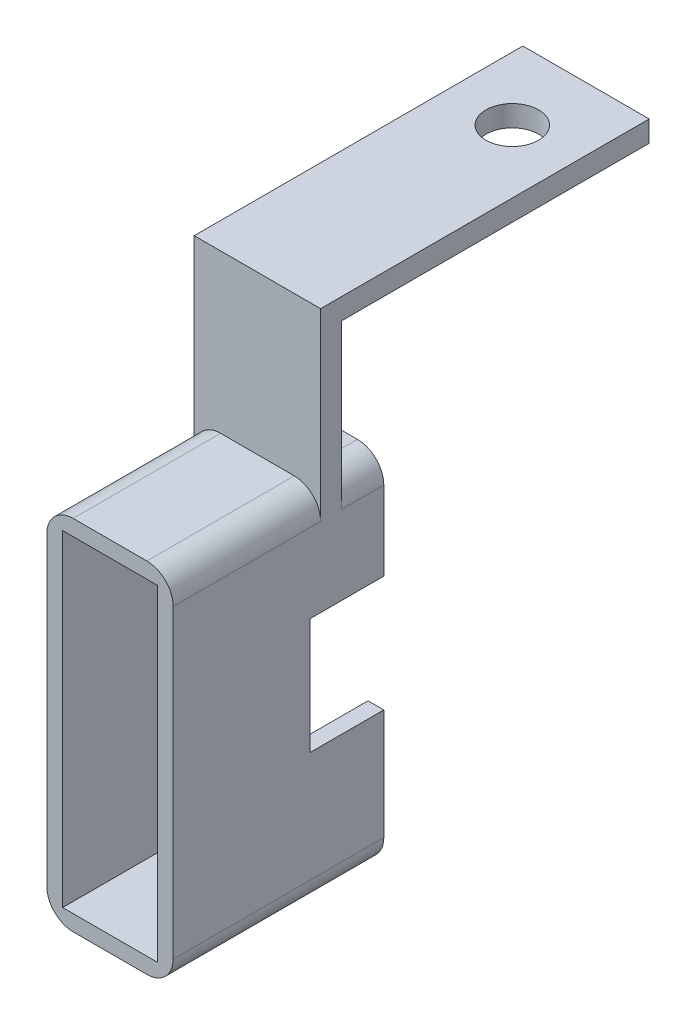
ISO-10303-21;
HEADER;
FILE_DESCRIPTION(('STEP AP214'),'2;1');
FILE_NAME('part.step','',(''),(''),'','','');
FILE_SCHEMA(('AUTOMOTIVE_DESIGN { 1 0 10303 214 1 1 1 1 }'));
ENDSEC;
DATA;
#1=APPLICATION_CONTEXT('core data for automotive mechanical design processes');
#2=APPLICATION_PROTOCOL_DEFINITION('international standard','automotive_design',2000,#1);
#3=PRODUCT_CONTEXT('',#1,'mechanical');
#4=PRODUCT('Part','Part','',(#3));
#5=PRODUCT_RELATED_PRODUCT_CATEGORY('part','',(#4));
#6=PRODUCT_DEFINITION_FORMATION('','',#4);
#7=PRODUCT_DEFINITION_CONTEXT('part definition',#1,'design');
#8=PRODUCT_DEFINITION('design','',#6,#7);
#9=PRODUCT_DEFINITION_SHAPE('','',#8);
#10=(LENGTH_UNIT() NAMED_UNIT(*) SI_UNIT(.MILLI.,.METRE.));
#11=(NAMED_UNIT(*) PLANE_ANGLE_UNIT() SI_UNIT($,.RADIAN.));
#12=(NAMED_UNIT(*) SI_UNIT($,.STERADIAN.) SOLID_ANGLE_UNIT());
#13=UNCERTAINTY_MEASURE_WITH_UNIT(LENGTH_MEASURE(1.E-05),#10,'distance_accuracy_value','');
#14=(GEOMETRIC_REPRESENTATION_CONTEXT(3) GLOBAL_UNCERTAINTY_ASSIGNED_CONTEXT((#13)) GLOBAL_UNIT_ASSIGNED_CONTEXT((#10,
#11,#12)) REPRESENTATION_CONTEXT('',''));
#15=CARTESIAN_POINT('',(0.,0.,0.));
#16=DIRECTION('',(0.,0.,1.));
#17=DIRECTION('',(1.,0.,0.));
#18=AXIS2_PLACEMENT_3D('',#15,#16,#17);
#19=CARTESIAN_POINT('',(0.,0.,0.));
#20=DIRECTION('',(0.,0.,1.));
#21=DIRECTION('',(1.,0.,0.));
#22=AXIS2_PLACEMENT_3D('',#19,#20,#21);
#23=PLANE('',#22);
#24=DIRECTION('',(0.,-1.,0.));
#25=VECTOR('',#24,1.);
#26=CARTESIAN_POINT('',(-22.2757146611833,-12.7781690140845,0.));
#27=LINE('',#26,#25);
#28=CARTESIAN_POINT('',(-22.2757146611833,-4.77816901408451,0.));
#29=VERTEX_POINT('',#28);
#30=CARTESIAN_POINT('',(-22.2757146611833,-14.2781690140845,0.));
#31=VERTEX_POINT('',#30);
#32=EDGE_CURVE('E244',#29,#31,#27,.T.);
#33=ORIENTED_EDGE('',*,*,#32,.F.);
#34=DIRECTION('',(1.,0.,0.));
#35=VECTOR('',#34,1.);
#36=CARTESIAN_POINT('',(-22.2757266611833,-4.77816901408451,0.));
#37=LINE('',#36,#35);
#38=CARTESIAN_POINT('',(-20.7757146611833,-4.77816901408451,0.));
#39=VERTEX_POINT('',#38);
#40=EDGE_CURVE('E237',#29,#39,#37,.T.);
#41=ORIENTED_EDGE('',*,*,#40,.T.);
#42=DIRECTION('',(0.,-1.,0.));
#43=VECTOR('',#42,1.);
#44=CARTESIAN_POINT('',(-20.7757146611833,15.7218309859155,0.));
#45=LINE('',#44,#43);
#46=CARTESIAN_POINT('',(-20.7757146611833,-15.2781690140845,0.));
#47=VERTEX_POINT('',#46);
#48=EDGE_CURVE('E347',#39,#47,#45,.T.);
#49=ORIENTED_EDGE('',*,*,#48,.T.);
#50=DIRECTION('',(1.,0.,0.));
#51=VECTOR('',#50,1.);
#52=CARTESIAN_POINT('',(-20.7757146611833,-15.2781690140845,0.));
#53=LINE('',#52,#51);
#54=CARTESIAN_POINT('',(-11.7757146611833,-15.2781690140845,0.));
#55=VERTEX_POINT('',#54);
#56=EDGE_CURVE('E355',#47,#55,#53,.T.);
#57=ORIENTED_EDGE('',*,*,#56,.T.);
#58=DIRECTION('',(0.,1.,0.));
#59=VECTOR('',#58,1.);
#60=CARTESIAN_POINT('',(-11.7757146611833,15.7218309859155,0.));
#61=LINE('',#60,#59);
#62=CARTESIAN_POINT('',(-11.7757146611833,-3.77816901408451,0.));
#63=VERTEX_POINT('',#62);
#64=EDGE_CURVE('E362',#55,#63,#61,.T.);
#65=ORIENTED_EDGE('',*,*,#64,.T.);
#66=DIRECTION('',(-1.,0.,0.));
#67=VECTOR('',#66,1.);
#68=CARTESIAN_POINT('',(-10.2757026611833,-3.77816901408451,0.));
#69=LINE('',#68,#67);
#70=CARTESIAN_POINT('',(-10.2757146611833,-3.77816901408451,0.));
#71=VERTEX_POINT('',#70);
#72=EDGE_CURVE('E60',#71,#63,#69,.T.);
#73=ORIENTED_EDGE('',*,*,#72,.F.);
#74=DIRECTION('',(0.,1.,0.));
#75=VECTOR('',#74,1.);
#76=CARTESIAN_POINT('',(-10.2757146611833,-16.7781690140845,0.));
#77=LINE('',#76,#75);
#78=CARTESIAN_POINT('',(-10.2757146611833,-14.2781690140845,0.));
#79=VERTEX_POINT('',#78);
#80=EDGE_CURVE('E253',#79,#71,#77,.T.);
#81=ORIENTED_EDGE('',*,*,#80,.F.);
#82=CARTESIAN_POINT('',(-12.7757146611833,-14.2781690140845,0.));
#83=DIRECTION('',(0.,0.,1.));
#84=DIRECTION('',(1.,0.,0.));
#85=AXIS2_PLACEMENT_3D('',#82,#83,#84);
#86=CIRCLE('',#85,2.5);
#87=CARTESIAN_POINT('',(-12.7757146611833,-16.7781690140845,0.));
#88=VERTEX_POINT('',#87);
#89=EDGE_CURVE('E270',#79,#88,#86,.F.);
#90=ORIENTED_EDGE('',*,*,#89,.T.);
#91=DIRECTION('',(1.,0.,0.));
#92=VECTOR('',#91,1.);
#93=CARTESIAN_POINT('',(-22.2757146611833,-16.7781690140845,0.));
#94=LINE('',#93,#92);
#95=CARTESIAN_POINT('',(-19.7757146611833,-16.7781690140845,0.));
#96=VERTEX_POINT('',#95);
#97=EDGE_CURVE('E243',#96,#88,#94,.T.);
#98=ORIENTED_EDGE('',*,*,#97,.F.);
#99=CARTESIAN_POINT('',(-19.7757146611833,-14.2781690140845,0.));
#100=DIRECTION('',(0.,0.,1.));
#101=DIRECTION('',(1.,0.,0.));
#102=AXIS2_PLACEMENT_3D('',#99,#100,#101);
#103=CIRCLE('',#102,2.5);
#104=EDGE_CURVE('E291',#96,#31,#103,.F.);
#105=ORIENTED_EDGE('',*,*,#104,.T.);
#106=EDGE_LOOP('',(#33,#41,#49,#57,#65,#73,#81,#90,#98,#105));
#107=FACE_BOUND('',#106,.T.);
#108=ADVANCED_FACE('F37',(#107),#23,.F.);
#109=CARTESIAN_POINT('',(-22.2757146611833,32.2218309859155,4.));
#110=DIRECTION('',(0.,0.,1.));
#111=DIRECTION('',(1.,0.,0.));
#112=AXIS2_PLACEMENT_3D('',#109,#110,#111);
#113=PLANE('',#112);
#114=DIRECTION('',(-1.,0.,0.));
#115=VECTOR('',#114,1.);
#116=CARTESIAN_POINT('',(-10.2757146611833,30.2218309859155,4.));
#117=LINE('',#116,#115);
#118=CARTESIAN_POINT('',(-10.2757146611833,30.2218309859155,4.));
#119=VERTEX_POINT('',#118);
#120=CARTESIAN_POINT('',(-22.2757146611833,30.2218309859155,4.));
#121=VERTEX_POINT('',#120);
#122=EDGE_CURVE('E263',#119,#121,#117,.T.);
#123=ORIENTED_EDGE('',*,*,#122,.F.);
#124=DIRECTION('',(0.,-1.,0.));
#125=VECTOR('',#124,1.);
#126=CARTESIAN_POINT('',(-10.2757146611833,32.2218309859155,4.));
#127=LINE('',#126,#125);
#128=CARTESIAN_POINT('',(-10.2757146611833,14.7218309859155,4.));
#129=VERTEX_POINT('',#128);
#130=EDGE_CURVE('E440',#119,#129,#127,.T.);
#131=ORIENTED_EDGE('',*,*,#130,.T.);
#132=CARTESIAN_POINT('',(-12.7757146611833,14.7218309859155,4.));
#133=DIRECTION('',(0.,0.,1.));
#134=DIRECTION('',(1.,0.,0.));
#135=AXIS2_PLACEMENT_3D('',#132,#133,#134);
#136=CIRCLE('',#135,2.5);
#137=CARTESIAN_POINT('',(-12.7757146611833,17.2218309859155,4.));
#138=VERTEX_POINT('',#137);
#139=EDGE_CURVE('E317',#129,#138,#136,.T.);
#140=ORIENTED_EDGE('',*,*,#139,.T.);
#141=DIRECTION('',(-1.,0.,0.));
#142=VECTOR('',#141,1.);
#143=CARTESIAN_POINT('',(-22.2757146611833,17.2218309859155,4.));
#144=LINE('',#143,#142);
#145=CARTESIAN_POINT('',(-19.7757146611833,17.2218309859155,4.));
#146=VERTEX_POINT('',#145);
#147=EDGE_CURVE('E426',#138,#146,#144,.T.);
#148=ORIENTED_EDGE('',*,*,#147,.T.);
#149=CARTESIAN_POINT('',(-19.7757146611833,14.7218309859155,4.));
#150=DIRECTION('',(0.,0.,1.));
#151=DIRECTION('',(1.,0.,0.));
#152=AXIS2_PLACEMENT_3D('',#149,#150,#151);
#153=CIRCLE('',#152,2.5);
#154=CARTESIAN_POINT('',(-22.2757146611833,14.7218309859155,4.));
#155=VERTEX_POINT('',#154);
#156=EDGE_CURVE('E319',#146,#155,#153,.T.);
#157=ORIENTED_EDGE('',*,*,#156,.T.);
#158=DIRECTION('',(0.,-1.,0.));
#159=VECTOR('',#158,1.);
#160=CARTESIAN_POINT('',(-22.2757146611833,32.2218309859155,4.));
#161=LINE('',#160,#159);
#162=EDGE_CURVE('E438',#121,#155,#161,.T.);
#163=ORIENTED_EDGE('',*,*,#162,.F.);
#164=EDGE_LOOP('',(#123,#131,#140,#148,#157,#163));
#165=FACE_BOUND('',#164,.T.);
#166=ADVANCED_FACE('F522',(#165),#113,.F.);
#167=CARTESIAN_POINT('',(-10.2757146611833,17.2218309859155,20.));
#168=DIRECTION('',(0.,-1.,0.));
#169=DIRECTION('',(0.,0.,-1.));
#170=AXIS2_PLACEMENT_3D('',#167,#168,#169);
#171=PLANE('',#170);
#172=ORIENTED_EDGE('',*,*,#147,.F.);
#173=DIRECTION('',(0.,0.,-1.));
#174=VECTOR('',#173,1.);
#175=CARTESIAN_POINT('',(-12.7757146611833,17.2218309859155,20.));
#176=LINE('',#175,#174);
#177=CARTESIAN_POINT('',(-12.7757146611833,17.2218309859155,0.));
#178=VERTEX_POINT('',#177);
#179=EDGE_CURVE('E288',#138,#178,#176,.T.);
#180=ORIENTED_EDGE('',*,*,#179,.T.);
#181=DIRECTION('',(-1.,0.,0.));
#182=VECTOR('',#181,1.);
#183=CARTESIAN_POINT('',(-10.2757146611833,17.2218309859155,0.));
#184=LINE('',#183,#182);
#185=CARTESIAN_POINT('',(-19.7757146611833,17.2218309859155,0.));
#186=VERTEX_POINT('',#185);
#187=EDGE_CURVE('E256',#178,#186,#184,.T.);
#188=ORIENTED_EDGE('',*,*,#187,.T.);
#189=DIRECTION('',(0.,0.,-1.));
#190=VECTOR('',#189,1.);
#191=CARTESIAN_POINT('',(-19.7757146611833,17.2218309859155,20.));
#192=LINE('',#191,#190);
#193=EDGE_CURVE('E286',#186,#146,#192,.F.);
#194=ORIENTED_EDGE('',*,*,#193,.T.);
#195=EDGE_LOOP('',(#172,#180,#188,#194));
#196=FACE_BOUND('',#195,.T.);
#197=ADVANCED_FACE('F530',(#196),#171,.F.);
#198=DIRECTION('',(1.,0.,0.));
#199=VECTOR('',#198,1.);
#200=CARTESIAN_POINT('',(-22.2757146611833,17.2218309859155,6.));
#201=LINE('',#200,#199);
#202=CARTESIAN_POINT('',(-19.7757146611833,17.2218309859155,6.));
#203=VERTEX_POINT('',#202);
#204=CARTESIAN_POINT('',(-12.7757146611833,17.2218309859155,6.));
#205=VERTEX_POINT('',#204);
#206=EDGE_CURVE('E424',#203,#205,#201,.T.);
#207=ORIENTED_EDGE('',*,*,#206,.F.);
#208=DIRECTION('',(0.,0.,-1.));
#209=VECTOR('',#208,1.);
#210=CARTESIAN_POINT('',(-19.7757146611833,17.2218309859155,20.));
#211=LINE('',#210,#209);
#212=CARTESIAN_POINT('',(-19.7757146611833,17.2218309859155,20.));
#213=VERTEX_POINT('',#212);
#214=EDGE_CURVE('E315',#203,#213,#211,.F.);
#215=ORIENTED_EDGE('',*,*,#214,.T.);
#216=DIRECTION('',(-1.,0.,0.));
#217=VECTOR('',#216,1.);
#218=CARTESIAN_POINT('',(-10.2757146611833,17.2218309859155,20.));
#219=LINE('',#218,#217);
#220=CARTESIAN_POINT('',(-12.7757146611833,17.2218309859155,20.));
#221=VERTEX_POINT('',#220);
#222=EDGE_CURVE('E250',#221,#213,#219,.T.);
#223=ORIENTED_EDGE('',*,*,#222,.F.);
#224=DIRECTION('',(0.,0.,-1.));
#225=VECTOR('',#224,1.);
#226=CARTESIAN_POINT('',(-12.7757146611833,17.2218309859155,20.));
#227=LINE('',#226,#225);
#228=EDGE_CURVE('E280',#221,#205,#227,.T.);
#229=ORIENTED_EDGE('',*,*,#228,.T.);
#230=EDGE_LOOP('',(#207,#215,#223,#229));
#231=FACE_BOUND('',#230,.T.);
#232=ADVANCED_FACE('F423',(#231),#171,.F.);
#233=CARTESIAN_POINT('',(0.,0.,20.));
#234=DIRECTION('',(0.,0.,1.));
#235=DIRECTION('',(1.,0.,0.));
#236=AXIS2_PLACEMENT_3D('',#233,#234,#235);
#237=PLANE('',#236);
#238=DIRECTION('',(0.,-1.,0.));
#239=VECTOR('',#238,1.);
#240=CARTESIAN_POINT('',(-22.2757146611833,17.2218309859155,20.));
#241=LINE('',#240,#239);
#242=CARTESIAN_POINT('',(-22.2757146611833,14.7218309859155,20.));
#243=VERTEX_POINT('',#242);
#244=CARTESIAN_POINT('',(-22.2757146611833,-14.2781690140845,20.));
#245=VERTEX_POINT('',#244);
#246=EDGE_CURVE('E259',#243,#245,#241,.T.);
#247=ORIENTED_EDGE('',*,*,#246,.T.);
#248=CARTESIAN_POINT('',(-19.7757146611833,-14.2781690140845,20.));
#249=DIRECTION('',(0.,0.,1.));
#250=DIRECTION('',(1.,0.,0.));
#251=AXIS2_PLACEMENT_3D('',#248,#249,#250);
#252=CIRCLE('',#251,2.5);
#253=CARTESIAN_POINT('',(-19.7757146611833,-16.7781690140845,20.));
#254=VERTEX_POINT('',#253);
#255=EDGE_CURVE('E313',#245,#254,#252,.T.);
#256=ORIENTED_EDGE('',*,*,#255,.T.);
#257=DIRECTION('',(1.,0.,0.));
#258=VECTOR('',#257,1.);
#259=CARTESIAN_POINT('',(-22.2757146611833,-16.7781690140845,20.));
#260=LINE('',#259,#258);
#261=CARTESIAN_POINT('',(-12.7757146611833,-16.7781690140845,20.));
#262=VERTEX_POINT('',#261);
#263=EDGE_CURVE('E377',#254,#262,#260,.T.);
#264=ORIENTED_EDGE('',*,*,#263,.T.);
#265=CARTESIAN_POINT('',(-12.7757146611833,-14.2781690140845,20.));
#266=DIRECTION('',(0.,0.,1.));
#267=DIRECTION('',(1.,0.,0.));
#268=AXIS2_PLACEMENT_3D('',#265,#266,#267);
#269=CIRCLE('',#268,2.5);
#270=CARTESIAN_POINT('',(-10.2757146611833,-14.2781690140845,20.));
#271=VERTEX_POINT('',#270);
#272=EDGE_CURVE('E278',#262,#271,#269,.T.);
#273=ORIENTED_EDGE('',*,*,#272,.T.);
#274=DIRECTION('',(0.,1.,0.));
#275=VECTOR('',#274,1.);
#276=CARTESIAN_POINT('',(-10.2757146611833,-16.7781690140845,20.));
#277=LINE('',#276,#275);
#278=CARTESIAN_POINT('',(-10.2757146611833,14.7218309859155,20.));
#279=VERTEX_POINT('',#278);
#280=EDGE_CURVE('E378',#271,#279,#277,.T.);
#281=ORIENTED_EDGE('',*,*,#280,.T.);
#282=CARTESIAN_POINT('',(-12.7757146611833,14.7218309859155,20.));
#283=DIRECTION('',(0.,0.,1.));
#284=DIRECTION('',(1.,0.,0.));
#285=AXIS2_PLACEMENT_3D('',#282,#283,#284);
#286=CIRCLE('',#285,2.5);
#287=EDGE_CURVE('E276',#279,#221,#286,.T.);
#288=ORIENTED_EDGE('',*,*,#287,.T.);
#289=ORIENTED_EDGE('',*,*,#222,.T.);
#290=CARTESIAN_POINT('',(-19.7757146611833,14.7218309859155,20.));
#291=DIRECTION('',(0.,0.,1.));
#292=DIRECTION('',(1.,0.,0.));
#293=AXIS2_PLACEMENT_3D('',#290,#291,#292);
#294=CIRCLE('',#293,2.5);
#295=EDGE_CURVE('E311',#213,#243,#294,.T.);
#296=ORIENTED_EDGE('',*,*,#295,.T.);
#297=EDGE_LOOP('',(#247,#256,#264,#273,#281,#288,#289,#296));
#298=FACE_BOUND('',#297,.T.);
#299=DIRECTION('',(0.,-1.,0.));
#300=VECTOR('',#299,1.);
#301=CARTESIAN_POINT('',(-20.7757146611833,15.7218309859155,20.));
#302=LINE('',#301,#300);
#303=CARTESIAN_POINT('',(-20.7757146611833,15.7218309859155,20.));
#304=VERTEX_POINT('',#303);
#305=CARTESIAN_POINT('',(-20.7757146611833,-15.2781690140845,20.));
#306=VERTEX_POINT('',#305);
#307=EDGE_CURVE('E445',#304,#306,#302,.T.);
#308=ORIENTED_EDGE('',*,*,#307,.F.);
#309=DIRECTION('',(-1.,0.,0.));
#310=VECTOR('',#309,1.);
#311=CARTESIAN_POINT('',(-20.7757146611833,15.7218309859155,20.));
#312=LINE('',#311,#310);
#313=CARTESIAN_POINT('',(-11.7757146611833,15.7218309859155,20.));
#314=VERTEX_POINT('',#313);
#315=EDGE_CURVE('E365',#314,#304,#312,.T.);
#316=ORIENTED_EDGE('',*,*,#315,.F.);
#317=DIRECTION('',(0.,1.,0.));
#318=VECTOR('',#317,1.);
#319=CARTESIAN_POINT('',(-11.7757146611833,15.7218309859155,20.));
#320=LINE('',#319,#318);
#321=CARTESIAN_POINT('',(-11.7757146611833,-15.2781690140845,20.));
#322=VERTEX_POINT('',#321);
#323=EDGE_CURVE('E370',#322,#314,#320,.T.);
#324=ORIENTED_EDGE('',*,*,#323,.F.);
#325=DIRECTION('',(1.,0.,0.));
#326=VECTOR('',#325,1.);
#327=CARTESIAN_POINT('',(-20.7757146611833,-15.2781690140845,20.));
#328=LINE('',#327,#326);
#329=EDGE_CURVE('E447',#306,#322,#328,.T.);
#330=ORIENTED_EDGE('',*,*,#329,.F.);
#331=EDGE_LOOP('',(#308,#316,#324,#330));
#332=FACE_BOUND('',#331,.T.);
#333=ADVANCED_FACE('F386',(#298,#332),#237,.T.);
#334=CARTESIAN_POINT('',(-20.7757146611833,15.7218309859155,0.));
#335=VERTEX_POINT('',#334);
#336=CARTESIAN_POINT('',(-20.7757146611833,4.22183098591549,0.));
#337=VERTEX_POINT('',#336);
#338=EDGE_CURVE('E236',#335,#337,#45,.T.);
#339=ORIENTED_EDGE('',*,*,#338,.T.);
#340=DIRECTION('',(1.,0.,0.));
#341=VECTOR('',#340,1.);
#342=CARTESIAN_POINT('',(-22.2757266611833,4.22183098591549,0.));
#343=LINE('',#342,#341);
#344=CARTESIAN_POINT('',(-22.2757146611833,4.22183098591549,0.));
#345=VERTEX_POINT('',#344);
#346=EDGE_CURVE('E52',#345,#337,#343,.T.);
#347=ORIENTED_EDGE('',*,*,#346,.F.);
#348=CARTESIAN_POINT('',(-22.2757146611833,14.7218309859155,0.));
#349=VERTEX_POINT('',#348);
#350=EDGE_CURVE('E234',#349,#345,#27,.T.);
#351=ORIENTED_EDGE('',*,*,#350,.F.);
#352=CARTESIAN_POINT('',(-19.7757146611833,14.7218309859155,0.));
#353=DIRECTION('',(0.,0.,1.));
#354=DIRECTION('',(1.,0.,0.));
#355=AXIS2_PLACEMENT_3D('',#352,#353,#354);
#356=CIRCLE('',#355,2.5);
#357=EDGE_CURVE('E294',#349,#186,#356,.F.);
#358=ORIENTED_EDGE('',*,*,#357,.T.);
#359=ORIENTED_EDGE('',*,*,#187,.F.);
#360=CARTESIAN_POINT('',(-12.7757146611833,14.7218309859155,0.));
#361=DIRECTION('',(0.,0.,1.));
#362=DIRECTION('',(1.,0.,0.));
#363=AXIS2_PLACEMENT_3D('',#360,#361,#362);
#364=CIRCLE('',#363,2.5);
#365=CARTESIAN_POINT('',(-10.2757146611833,14.7218309859155,0.));
#366=VERTEX_POINT('',#365);
#367=EDGE_CURVE('E296',#178,#366,#364,.F.);
#368=ORIENTED_EDGE('',*,*,#367,.T.);
#369=CARTESIAN_POINT('',(-10.2757146611833,7.2218309859155,0.));
#370=VERTEX_POINT('',#369);
#371=EDGE_CURVE('E246',#370,#366,#77,.T.);
#372=ORIENTED_EDGE('',*,*,#371,.F.);
#373=DIRECTION('',(-1.,0.,0.));
#374=VECTOR('',#373,1.);
#375=CARTESIAN_POINT('',(-10.2757026611833,7.2218309859155,0.));
#376=LINE('',#375,#374);
#377=CARTESIAN_POINT('',(-11.7757146611833,7.2218309859155,0.));
#378=VERTEX_POINT('',#377);
#379=EDGE_CURVE('E480',#370,#378,#376,.T.);
#380=ORIENTED_EDGE('',*,*,#379,.T.);
#381=CARTESIAN_POINT('',(-11.7757146611833,15.7218309859155,0.));
#382=VERTEX_POINT('',#381);
#383=EDGE_CURVE('E361',#378,#382,#61,.T.);
#384=ORIENTED_EDGE('',*,*,#383,.T.);
#385=DIRECTION('',(-1.,0.,0.));
#386=VECTOR('',#385,1.);
#387=CARTESIAN_POINT('',(-20.7757146611833,15.7218309859155,0.));
#388=LINE('',#387,#386);
#389=EDGE_CURVE('E353',#382,#335,#388,.T.);
#390=ORIENTED_EDGE('',*,*,#389,.T.);
#391=EDGE_LOOP('',(#339,#347,#351,#358,#359,#368,#372,#380,#384,#390));
#392=FACE_BOUND('',#391,.T.);
#393=ADVANCED_FACE('F233',(#392),#23,.F.);
#394=CARTESIAN_POINT('',(-22.2757146611833,-12.7781690140845,20.));
#395=DIRECTION('',(1.,0.,0.));
#396=DIRECTION('',(0.,0.,-1.));
#397=AXIS2_PLACEMENT_3D('',#394,#395,#396);
#398=PLANE('',#397);
#399=DIRECTION('',(0.,-1.,0.));
#400=VECTOR('',#399,1.);
#401=CARTESIAN_POINT('',(-22.2757146611833,-12.7781690140845,7.));
#402=LINE('',#401,#400);
#403=CARTESIAN_POINT('',(-22.2757146611833,4.22183098591549,7.));
#404=VERTEX_POINT('',#403);
#405=CARTESIAN_POINT('',(-22.2757146611833,-4.77816901408451,7.));
#406=VERTEX_POINT('',#405);
#407=EDGE_CURVE('E227',#404,#406,#402,.T.);
#408=ORIENTED_EDGE('',*,*,#407,.T.);
#409=DIRECTION('',(0.,0.,-1.));
#410=VECTOR('',#409,1.);
#411=CARTESIAN_POINT('',(-22.2757146611833,-4.7781690140845,20.));
#412=LINE('',#411,#410);
#413=EDGE_CURVE('E342',#406,#29,#412,.T.);
#414=ORIENTED_EDGE('',*,*,#413,.T.);
#415=ORIENTED_EDGE('',*,*,#32,.T.);
#416=DIRECTION('',(0.,0.,-1.));
#417=VECTOR('',#416,1.);
#418=CARTESIAN_POINT('',(-22.2757146611833,-14.2781690140845,20.));
#419=LINE('',#418,#417);
#420=EDGE_CURVE('E305',#31,#245,#419,.F.);
#421=ORIENTED_EDGE('',*,*,#420,.T.);
#422=ORIENTED_EDGE('',*,*,#246,.F.);
#423=DIRECTION('',(0.,0.,-1.));
#424=VECTOR('',#423,1.);
#425=CARTESIAN_POINT('',(-22.2757146611833,14.7218309859155,20.));
#426=LINE('',#425,#424);
#427=CARTESIAN_POINT('',(-22.2757146611833,14.7218309859155,6.));
#428=VERTEX_POINT('',#427);
#429=EDGE_CURVE('E302',#243,#428,#426,.T.);
#430=ORIENTED_EDGE('',*,*,#429,.T.);
#431=DIRECTION('',(0.,-1.,0.));
#432=VECTOR('',#431,1.);
#433=CARTESIAN_POINT('',(-22.2757146611833,32.2218309859155,6.));
#434=LINE('',#433,#432);
#435=CARTESIAN_POINT('',(-22.2757146611833,32.2218309859155,6.));
#436=VERTEX_POINT('',#435);
#437=EDGE_CURVE('E356',#436,#428,#434,.T.);
#438=ORIENTED_EDGE('',*,*,#437,.F.);
#439=DIRECTION('',(0.,0.,1.));
#440=VECTOR('',#439,1.);
#441=CARTESIAN_POINT('',(-22.2757146611833,32.2218309859155,4.));
#442=LINE('',#441,#440);
#443=CARTESIAN_POINT('',(-22.2757146611833,32.2218309859155,-25.2));
#444=VERTEX_POINT('',#443);
#445=EDGE_CURVE('E430',#444,#436,#442,.T.);
#446=ORIENTED_EDGE('',*,*,#445,.F.);
#447=DIRECTION('',(0.,1.,0.));
#448=VECTOR('',#447,1.);
#449=CARTESIAN_POINT('',(-22.2757146611833,30.2218309859155,-25.2));
#450=LINE('',#449,#448);
#451=CARTESIAN_POINT('',(-22.2757146611833,30.2218309859155,-25.2));
#452=VERTEX_POINT('',#451);
#453=EDGE_CURVE('E496',#452,#444,#450,.T.);
#454=ORIENTED_EDGE('',*,*,#453,.F.);
#455=DIRECTION('',(0.,0.,1.));
#456=VECTOR('',#455,1.);
#457=CARTESIAN_POINT('',(-22.2757146611833,30.2218309859155,-25.2));
#458=LINE('',#457,#456);
#459=EDGE_CURVE('E432',#452,#121,#458,.T.);
#460=ORIENTED_EDGE('',*,*,#459,.T.);
#461=ORIENTED_EDGE('',*,*,#162,.T.);
#462=DIRECTION('',(0.,0.,-1.));
#463=VECTOR('',#462,1.);
#464=CARTESIAN_POINT('',(-22.2757146611833,14.7218309859155,20.));
#465=LINE('',#464,#463);
#466=EDGE_CURVE('E242',#155,#349,#465,.T.);
#467=ORIENTED_EDGE('',*,*,#466,.T.);
#468=ORIENTED_EDGE('',*,*,#350,.T.);
#469=DIRECTION('',(0.,0.,1.));
#470=VECTOR('',#469,1.);
#471=CARTESIAN_POINT('',(-22.2757146611833,4.22183098591549,20.));
#472=LINE('',#471,#470);
#473=EDGE_CURVE('E220',#345,#404,#472,.T.);
#474=ORIENTED_EDGE('',*,*,#473,.T.);
#475=EDGE_LOOP('',(#408,#414,#415,#421,#422,#430,#438,#446,#454,#460,#461,#467,#468,#474));
#476=FACE_BOUND('',#475,.T.);
#477=ADVANCED_FACE('F240',(#476),#398,.F.);
#478=CARTESIAN_POINT('',(-22.2757146611833,-16.7781690140845,20.));
#479=DIRECTION('',(0.,1.,0.));
#480=DIRECTION('',(0.,0.,1.));
#481=AXIS2_PLACEMENT_3D('',#478,#479,#480);
#482=PLANE('',#481);
#483=ORIENTED_EDGE('',*,*,#263,.F.);
#484=DIRECTION('',(0.,0.,-1.));
#485=VECTOR('',#484,1.);
#486=CARTESIAN_POINT('',(-19.7757146611833,-16.7781690140845,20.));
#487=LINE('',#486,#485);
#488=EDGE_CURVE('E308',#254,#96,#487,.T.);
#489=ORIENTED_EDGE('',*,*,#488,.T.);
#490=ORIENTED_EDGE('',*,*,#97,.T.);
#491=DIRECTION('',(0.,0.,-1.));
#492=VECTOR('',#491,1.);
#493=CARTESIAN_POINT('',(-12.7757146611833,-16.7781690140845,20.));
#494=LINE('',#493,#492);
#495=EDGE_CURVE('E273',#88,#262,#494,.F.);
#496=ORIENTED_EDGE('',*,*,#495,.T.);
#497=EDGE_LOOP('',(#483,#489,#490,#496));
#498=FACE_BOUND('',#497,.T.);
#499=ADVANCED_FACE('F404',(#498),#482,.F.);
#500=CARTESIAN_POINT('',(-10.2757146611833,-16.7781690140845,20.));
#501=DIRECTION('',(-1.,0.,0.));
#502=DIRECTION('',(0.,0.,1.));
#503=AXIS2_PLACEMENT_3D('',#500,#501,#502);
#504=PLANE('',#503);
#505=DIRECTION('',(0.,1.,0.));
#506=VECTOR('',#505,1.);
#507=CARTESIAN_POINT('',(-10.2757146611833,-16.7781690140845,7.));
#508=LINE('',#507,#506);
#509=CARTESIAN_POINT('',(-10.2757146611833,-3.77816901408451,7.));
#510=VERTEX_POINT('',#509);
#511=CARTESIAN_POINT('',(-10.2757146611833,7.2218309859155,7.));
#512=VERTEX_POINT('',#511);
#513=EDGE_CURVE('E475',#510,#512,#508,.T.);
#514=ORIENTED_EDGE('',*,*,#513,.T.);
#515=DIRECTION('',(0.,0.,-1.));
#516=VECTOR('',#515,1.);
#517=CARTESIAN_POINT('',(-10.2757146611833,7.22183098591549,20.));
#518=LINE('',#517,#516);
#519=EDGE_CURVE('E486',#512,#370,#518,.T.);
#520=ORIENTED_EDGE('',*,*,#519,.T.);
#521=ORIENTED_EDGE('',*,*,#371,.T.);
#522=DIRECTION('',(0.,0.,-1.));
#523=VECTOR('',#522,1.);
#524=CARTESIAN_POINT('',(-10.2757146611833,14.7218309859155,20.));
#525=LINE('',#524,#523);
#526=EDGE_CURVE('E299',#366,#129,#525,.F.);
#527=ORIENTED_EDGE('',*,*,#526,.T.);
#528=ORIENTED_EDGE('',*,*,#130,.F.);
#529=DIRECTION('',(0.,0.,1.));
#530=VECTOR('',#529,1.);
#531=CARTESIAN_POINT('',(-10.2757146611833,30.2218309859155,-25.2));
#532=LINE('',#531,#530);
#533=CARTESIAN_POINT('',(-10.2757146611833,30.2218309859155,-25.2));
#534=VERTEX_POINT('',#533);
#535=EDGE_CURVE('E427',#534,#119,#532,.T.);
#536=ORIENTED_EDGE('',*,*,#535,.F.);
#537=DIRECTION('',(0.,-1.,0.));
#538=VECTOR('',#537,1.);
#539=CARTESIAN_POINT('',(-10.2757146611833,32.2218309859155,-25.2));
#540=LINE('',#539,#538);
#541=CARTESIAN_POINT('',(-10.2757146611833,32.2218309859155,-25.2));
#542=VERTEX_POINT('',#541);
#543=EDGE_CURVE('E491',#542,#534,#540,.T.);
#544=ORIENTED_EDGE('',*,*,#543,.F.);
#545=DIRECTION('',(0.,0.,-1.));
#546=VECTOR('',#545,1.);
#547=CARTESIAN_POINT('',(-10.2757146611833,32.2218309859155,6.));
#548=LINE('',#547,#546);
#549=CARTESIAN_POINT('',(-10.2757146611833,32.2218309859155,6.));
#550=VERTEX_POINT('',#549);
#551=EDGE_CURVE('E435',#550,#542,#548,.T.);
#552=ORIENTED_EDGE('',*,*,#551,.F.);
#553=DIRECTION('',(0.,-1.,0.));
#554=VECTOR('',#553,1.);
#555=CARTESIAN_POINT('',(-10.2757146611833,32.2218309859155,6.));
#556=LINE('',#555,#554);
#557=CARTESIAN_POINT('',(-10.2757146611833,14.7218309859155,6.));
#558=VERTEX_POINT('',#557);
#559=EDGE_CURVE('E418',#550,#558,#556,.T.);
#560=ORIENTED_EDGE('',*,*,#559,.T.);
#561=DIRECTION('',(0.,0.,-1.));
#562=VECTOR('',#561,1.);
#563=CARTESIAN_POINT('',(-10.2757146611833,14.7218309859155,20.));
#564=LINE('',#563,#562);
#565=EDGE_CURVE('E265',#558,#279,#564,.F.);
#566=ORIENTED_EDGE('',*,*,#565,.T.);
#567=ORIENTED_EDGE('',*,*,#280,.F.);
#568=DIRECTION('',(0.,0.,-1.));
#569=VECTOR('',#568,1.);
#570=CARTESIAN_POINT('',(-10.2757146611833,-14.2781690140845,20.));
#571=LINE('',#570,#569);
#572=EDGE_CURVE('E267',#271,#79,#571,.T.);
#573=ORIENTED_EDGE('',*,*,#572,.T.);
#574=ORIENTED_EDGE('',*,*,#80,.T.);
#575=DIRECTION('',(0.,0.,1.));
#576=VECTOR('',#575,1.);
#577=CARTESIAN_POINT('',(-10.2757146611833,-3.77816901408451,20.));
#578=LINE('',#577,#576);
#579=EDGE_CURVE('E478',#71,#510,#578,.T.);
#580=ORIENTED_EDGE('',*,*,#579,.T.);
#581=EDGE_LOOP('',(#514,#520,#521,#527,#528,#536,#544,#552,#560,#566,#567,#573,#574,#580));
#582=FACE_BOUND('',#581,.T.);
#583=ADVANCED_FACE('F414',(#582),#504,.F.);
#584=CARTESIAN_POINT('',(-20.7757146611833,15.7218309859155,20.));
#585=DIRECTION('',(0.,-1.,0.));
#586=DIRECTION('',(1.,0.,0.));
#587=AXIS2_PLACEMENT_3D('',#584,#585,#586);
#588=PLANE('',#587);
#589=ORIENTED_EDGE('',*,*,#389,.F.);
#590=DIRECTION('',(0.,0.,-1.));
#591=VECTOR('',#590,1.);
#592=CARTESIAN_POINT('',(-11.7757146611833,15.7218309859155,20.));
#593=LINE('',#592,#591);
#594=EDGE_CURVE('E366',#314,#382,#593,.T.);
#595=ORIENTED_EDGE('',*,*,#594,.F.);
#596=ORIENTED_EDGE('',*,*,#315,.T.);
#597=DIRECTION('',(0.,0.,-1.));
#598=VECTOR('',#597,1.);
#599=CARTESIAN_POINT('',(-20.7757146611833,15.7218309859155,20.));
#600=LINE('',#599,#598);
#601=EDGE_CURVE('E248',#304,#335,#600,.T.);
#602=ORIENTED_EDGE('',*,*,#601,.T.);
#603=EDGE_LOOP('',(#589,#595,#596,#602));
#604=FACE_BOUND('',#603,.T.);
#605=ADVANCED_FACE('F460',(#604),#588,.T.);
#606=CARTESIAN_POINT('',(-20.7757146611833,15.7218309859155,20.));
#607=DIRECTION('',(1.,0.,0.));
#608=DIRECTION('',(0.,0.,-1.));
#609=AXIS2_PLACEMENT_3D('',#606,#607,#608);
#610=PLANE('',#609);
#611=DIRECTION('',(0.,0.,-1.));
#612=VECTOR('',#611,1.);
#613=CARTESIAN_POINT('',(-20.7757146611833,-4.77816901408451,20.));
#614=LINE('',#613,#612);
#615=CARTESIAN_POINT('',(-20.7757146611833,-4.77816901408451,7.));
#616=VERTEX_POINT('',#615);
#617=EDGE_CURVE('E12',#616,#39,#614,.T.);
#618=ORIENTED_EDGE('',*,*,#617,.F.);
#619=DIRECTION('',(0.,-1.,0.));
#620=VECTOR('',#619,1.);
#621=CARTESIAN_POINT('',(-20.7757146611833,15.7218309859155,7.));
#622=LINE('',#621,#620);
#623=CARTESIAN_POINT('',(-20.7757146611833,4.22183098591549,7.));
#624=VERTEX_POINT('',#623);
#625=EDGE_CURVE('E45',#624,#616,#622,.T.);
#626=ORIENTED_EDGE('',*,*,#625,.F.);
#627=DIRECTION('',(0.,0.,1.));
#628=VECTOR('',#627,1.);
#629=CARTESIAN_POINT('',(-20.7757146611833,4.22183098591549,20.));
#630=LINE('',#629,#628);
#631=EDGE_CURVE('E330',#337,#624,#630,.T.);
#632=ORIENTED_EDGE('',*,*,#631,.F.);
#633=ORIENTED_EDGE('',*,*,#338,.F.);
#634=ORIENTED_EDGE('',*,*,#601,.F.);
#635=ORIENTED_EDGE('',*,*,#307,.T.);
#636=DIRECTION('',(0.,0.,-1.));
#637=VECTOR('',#636,1.);
#638=CARTESIAN_POINT('',(-20.7757146611833,-15.2781690140845,20.));
#639=LINE('',#638,#637);
#640=EDGE_CURVE('E349',#306,#47,#639,.T.);
#641=ORIENTED_EDGE('',*,*,#640,.T.);
#642=ORIENTED_EDGE('',*,*,#48,.F.);
#643=EDGE_LOOP('',(#618,#626,#632,#633,#634,#635,#641,#642));
#644=FACE_BOUND('',#643,.T.);
#645=ADVANCED_FACE('F345',(#644),#610,.T.);
#646=CARTESIAN_POINT('',(-20.7757146611833,-15.2781690140845,20.));
#647=DIRECTION('',(0.,1.,0.));
#648=DIRECTION('',(0.,0.,1.));
#649=AXIS2_PLACEMENT_3D('',#646,#647,#648);
#650=PLANE('',#649);
#651=ORIENTED_EDGE('',*,*,#56,.F.);
#652=ORIENTED_EDGE('',*,*,#640,.F.);
#653=ORIENTED_EDGE('',*,*,#329,.T.);
#654=DIRECTION('',(0.,0.,-1.));
#655=VECTOR('',#654,1.);
#656=CARTESIAN_POINT('',(-11.7757146611833,-15.2781690140845,20.));
#657=LINE('',#656,#655);
#658=EDGE_CURVE('E369',#322,#55,#657,.T.);
#659=ORIENTED_EDGE('',*,*,#658,.T.);
#660=EDGE_LOOP('',(#651,#652,#653,#659));
#661=FACE_BOUND('',#660,.T.);
#662=ADVANCED_FACE('F464',(#661),#650,.T.);
#663=CARTESIAN_POINT('',(-11.7757146611833,15.7218309859155,20.));
#664=DIRECTION('',(-1.,0.,0.));
#665=DIRECTION('',(0.,-1.,0.));
#666=AXIS2_PLACEMENT_3D('',#663,#664,#665);
#667=PLANE('',#666);
#668=DIRECTION('',(0.,0.,-1.));
#669=VECTOR('',#668,1.);
#670=CARTESIAN_POINT('',(-11.7757146611833,7.2218309859155,20.));
#671=LINE('',#670,#669);
#672=CARTESIAN_POINT('',(-11.7757146611833,7.2218309859155,7.));
#673=VERTEX_POINT('',#672);
#674=EDGE_CURVE('E328',#673,#378,#671,.T.);
#675=ORIENTED_EDGE('',*,*,#674,.F.);
#676=DIRECTION('',(0.,1.,0.));
#677=VECTOR('',#676,1.);
#678=CARTESIAN_POINT('',(-11.7757146611833,15.7218309859155,7.));
#679=LINE('',#678,#677);
#680=CARTESIAN_POINT('',(-11.7757146611833,-3.77816901408451,7.));
#681=VERTEX_POINT('',#680);
#682=EDGE_CURVE('E326',#681,#673,#679,.T.);
#683=ORIENTED_EDGE('',*,*,#682,.F.);
#684=DIRECTION('',(0.,0.,1.));
#685=VECTOR('',#684,1.);
#686=CARTESIAN_POINT('',(-11.7757146611833,-3.77816901408451,20.));
#687=LINE('',#686,#685);
#688=EDGE_CURVE('E324',#63,#681,#687,.T.);
#689=ORIENTED_EDGE('',*,*,#688,.F.);
#690=ORIENTED_EDGE('',*,*,#64,.F.);
#691=ORIENTED_EDGE('',*,*,#658,.F.);
#692=ORIENTED_EDGE('',*,*,#323,.T.);
#693=ORIENTED_EDGE('',*,*,#594,.T.);
#694=ORIENTED_EDGE('',*,*,#383,.F.);
#695=EDGE_LOOP('',(#675,#683,#689,#690,#691,#692,#693,#694));
#696=FACE_BOUND('',#695,.T.);
#697=ADVANCED_FACE('F453',(#696),#667,.T.);
#698=CARTESIAN_POINT('',(-22.2757146611833,32.2218309859155,6.));
#699=DIRECTION('',(0.,0.,-1.));
#700=DIRECTION('',(-1.,0.,0.));
#701=AXIS2_PLACEMENT_3D('',#698,#699,#700);
#702=PLANE('',#701);
#703=ORIENTED_EDGE('',*,*,#437,.T.);
#704=CARTESIAN_POINT('',(-19.7757146611833,14.7218309859155,6.));
#705=DIRECTION('',(0.,0.,-1.));
#706=DIRECTION('',(-1.,0.,0.));
#707=AXIS2_PLACEMENT_3D('',#704,#705,#706);
#708=CIRCLE('',#707,2.5);
#709=EDGE_CURVE('E322',#428,#203,#708,.T.);
#710=ORIENTED_EDGE('',*,*,#709,.T.);
#711=ORIENTED_EDGE('',*,*,#206,.T.);
#712=CARTESIAN_POINT('',(-12.7757146611833,14.7218309859155,6.));
#713=DIRECTION('',(0.,0.,-1.));
#714=DIRECTION('',(-1.,0.,0.));
#715=AXIS2_PLACEMENT_3D('',#712,#713,#714);
#716=CIRCLE('',#715,2.5);
#717=EDGE_CURVE('E283',#205,#558,#716,.T.);
#718=ORIENTED_EDGE('',*,*,#717,.T.);
#719=ORIENTED_EDGE('',*,*,#559,.F.);
#720=DIRECTION('',(1.,0.,0.));
#721=VECTOR('',#720,1.);
#722=CARTESIAN_POINT('',(-22.2757146611833,32.2218309859155,6.));
#723=LINE('',#722,#721);
#724=EDGE_CURVE('E506',#436,#550,#723,.T.);
#725=ORIENTED_EDGE('',*,*,#724,.F.);
#726=EDGE_LOOP('',(#703,#710,#711,#718,#719,#725));
#727=FACE_BOUND('',#726,.T.);
#728=ADVANCED_FACE('F578',(#727),#702,.F.);
#729=CARTESIAN_POINT('',(0.,32.2218309859155,0.));
#730=DIRECTION('',(0.,1.,0.));
#731=DIRECTION('',(0.,0.,1.));
#732=AXIS2_PLACEMENT_3D('',#729,#730,#731);
#733=PLANE('',#732);
#734=CARTESIAN_POINT('',(-16.2757146611833,32.2218309859155,-18.2));
#735=DIRECTION('',(0.,1.,0.));
#736=DIRECTION('',(0.,0.,1.));
#737=AXIS2_PLACEMENT_3D('',#734,#735,#736);
#738=CIRCLE('',#737,2.5);
#739=CARTESIAN_POINT('',(-16.2757146611833,32.2218309859155,-15.7));
#740=VERTEX_POINT('',#739);
#741=EDGE_CURVE('E264',#740,#740,#738,.T.);
#742=ORIENTED_EDGE('',*,*,#741,.F.);
#743=EDGE_LOOP('',(#742));
#744=FACE_BOUND('',#743,.T.);
#745=ORIENTED_EDGE('',*,*,#445,.T.);
#746=ORIENTED_EDGE('',*,*,#724,.T.);
#747=ORIENTED_EDGE('',*,*,#551,.T.);
#748=DIRECTION('',(1.,0.,0.));
#749=VECTOR('',#748,1.);
#750=CARTESIAN_POINT('',(-22.2757146611833,32.2218309859155,-25.2));
#751=LINE('',#750,#749);
#752=EDGE_CURVE('E499',#444,#542,#751,.T.);
#753=ORIENTED_EDGE('',*,*,#752,.F.);
#754=EDGE_LOOP('',(#745,#746,#747,#753));
#755=FACE_BOUND('',#754,.T.);
#756=ADVANCED_FACE('F509',(#744,#755),#733,.T.);
#757=CARTESIAN_POINT('',(-10.2757146611833,30.2218309859155,-25.2));
#758=DIRECTION('',(0.,1.,0.));
#759=DIRECTION('',(0.,0.,1.));
#760=AXIS2_PLACEMENT_3D('',#757,#758,#759);
#761=PLANE('',#760);
#762=CARTESIAN_POINT('',(-16.2757146611833,30.2218309859155,-18.2));
#763=DIRECTION('',(0.,1.,0.));
#764=DIRECTION('',(0.,0.,1.));
#765=AXIS2_PLACEMENT_3D('',#762,#763,#764);
#766=CIRCLE('',#765,2.5);
#767=CARTESIAN_POINT('',(-16.2757146611833,30.2218309859155,-15.7));
#768=VERTEX_POINT('',#767);
#769=EDGE_CURVE('E260',#768,#768,#766,.T.);
#770=ORIENTED_EDGE('',*,*,#769,.T.);
#771=EDGE_LOOP('',(#770));
#772=FACE_BOUND('',#771,.T.);
#773=ORIENTED_EDGE('',*,*,#122,.T.);
#774=ORIENTED_EDGE('',*,*,#459,.F.);
#775=DIRECTION('',(-1.,0.,0.));
#776=VECTOR('',#775,1.);
#777=CARTESIAN_POINT('',(-10.2757146611833,30.2218309859155,-25.2));
#778=LINE('',#777,#776);
#779=EDGE_CURVE('E494',#534,#452,#778,.T.);
#780=ORIENTED_EDGE('',*,*,#779,.F.);
#781=ORIENTED_EDGE('',*,*,#535,.T.);
#782=EDGE_LOOP('',(#773,#774,#780,#781));
#783=FACE_BOUND('',#782,.T.);
#784=ADVANCED_FACE('F518',(#772,#783),#761,.F.);
#785=CARTESIAN_POINT('',(0.,0.,-25.2));
#786=DIRECTION('',(0.,0.,-1.));
#787=DIRECTION('',(-1.,0.,0.));
#788=AXIS2_PLACEMENT_3D('',#785,#786,#787);
#789=PLANE('',#788);
#790=ORIENTED_EDGE('',*,*,#543,.T.);
#791=ORIENTED_EDGE('',*,*,#779,.T.);
#792=ORIENTED_EDGE('',*,*,#453,.T.);
#793=ORIENTED_EDGE('',*,*,#752,.T.);
#794=EDGE_LOOP('',(#790,#791,#792,#793));
#795=FACE_BOUND('',#794,.T.);
#796=ADVANCED_FACE('F512',(#795),#789,.T.);
#797=CARTESIAN_POINT('',(-16.2757146611833,22.2218309859155,-18.2));
#798=DIRECTION('',(0.,1.,0.));
#799=DIRECTION('',(0.,0.,1.));
#800=AXIS2_PLACEMENT_3D('',#797,#798,#799);
#801=CYLINDRICAL_SURFACE('',#800,2.5);
#802=ORIENTED_EDGE('',*,*,#741,.T.);
#803=EDGE_LOOP('',(#802));
#804=FACE_BOUND('',#803,.T.);
#805=ORIENTED_EDGE('',*,*,#769,.F.);
#806=EDGE_LOOP('',(#805));
#807=FACE_BOUND('',#806,.T.);
#808=ADVANCED_FACE('F588',(#804,#807),#801,.F.);
#809=CARTESIAN_POINT('',(-12.7757146611833,-14.2781690140845,20.));
#810=DIRECTION('',(0.,0.,-1.));
#811=DIRECTION('',(-1.,0.,0.));
#812=AXIS2_PLACEMENT_3D('',#809,#810,#811);
#813=CYLINDRICAL_SURFACE('',#812,2.5);
#814=ORIENTED_EDGE('',*,*,#272,.F.);
#815=ORIENTED_EDGE('',*,*,#495,.F.);
#816=ORIENTED_EDGE('',*,*,#89,.F.);
#817=ORIENTED_EDGE('',*,*,#572,.F.);
#818=EDGE_LOOP('',(#814,#815,#816,#817));
#819=FACE_BOUND('',#818,.T.);
#820=ADVANCED_FACE('F411',(#819),#813,.T.);
#821=CARTESIAN_POINT('',(-12.7757146611833,14.7218309859155,20.));
#822=DIRECTION('',(0.,0.,-1.));
#823=DIRECTION('',(-1.,0.,0.));
#824=AXIS2_PLACEMENT_3D('',#821,#822,#823);
#825=CYLINDRICAL_SURFACE('',#824,2.5);
#826=ORIENTED_EDGE('',*,*,#287,.F.);
#827=ORIENTED_EDGE('',*,*,#565,.F.);
#828=ORIENTED_EDGE('',*,*,#717,.F.);
#829=ORIENTED_EDGE('',*,*,#228,.F.);
#830=EDGE_LOOP('',(#826,#827,#828,#829));
#831=FACE_BOUND('',#830,.T.);
#832=ADVANCED_FACE('F421',(#831),#825,.T.);
#833=CARTESIAN_POINT('',(-12.7757146611833,14.7218309859155,20.));
#834=DIRECTION('',(0.,0.,-1.));
#835=DIRECTION('',(-1.,0.,0.));
#836=AXIS2_PLACEMENT_3D('',#833,#834,#835);
#837=CYLINDRICAL_SURFACE('',#836,2.5);
#838=ORIENTED_EDGE('',*,*,#139,.F.);
#839=ORIENTED_EDGE('',*,*,#526,.F.);
#840=ORIENTED_EDGE('',*,*,#367,.F.);
#841=ORIENTED_EDGE('',*,*,#179,.F.);
#842=EDGE_LOOP('',(#838,#839,#840,#841));
#843=FACE_BOUND('',#842,.T.);
#844=ADVANCED_FACE('F534',(#843),#837,.T.);
#845=CARTESIAN_POINT('',(-19.7757146611833,14.7218309859155,20.));
#846=DIRECTION('',(0.,0.,-1.));
#847=DIRECTION('',(-1.,0.,0.));
#848=AXIS2_PLACEMENT_3D('',#845,#846,#847);
#849=CYLINDRICAL_SURFACE('',#848,2.5);
#850=ORIENTED_EDGE('',*,*,#156,.F.);
#851=ORIENTED_EDGE('',*,*,#193,.F.);
#852=ORIENTED_EDGE('',*,*,#357,.F.);
#853=ORIENTED_EDGE('',*,*,#466,.F.);
#854=EDGE_LOOP('',(#850,#851,#852,#853));
#855=FACE_BOUND('',#854,.T.);
#856=ADVANCED_FACE('F527',(#855),#849,.T.);
#857=CARTESIAN_POINT('',(-19.7757146611833,-14.2781690140845,20.));
#858=DIRECTION('',(0.,0.,-1.));
#859=DIRECTION('',(-1.,0.,0.));
#860=AXIS2_PLACEMENT_3D('',#857,#858,#859);
#861=CYLINDRICAL_SURFACE('',#860,2.5);
#862=ORIENTED_EDGE('',*,*,#255,.F.);
#863=ORIENTED_EDGE('',*,*,#420,.F.);
#864=ORIENTED_EDGE('',*,*,#104,.F.);
#865=ORIENTED_EDGE('',*,*,#488,.F.);
#866=EDGE_LOOP('',(#862,#863,#864,#865));
#867=FACE_BOUND('',#866,.T.);
#868=ADVANCED_FACE('F401',(#867),#861,.T.);
#869=CARTESIAN_POINT('',(-19.7757146611833,14.7218309859155,20.));
#870=DIRECTION('',(0.,0.,-1.));
#871=DIRECTION('',(-1.,0.,0.));
#872=AXIS2_PLACEMENT_3D('',#869,#870,#871);
#873=CYLINDRICAL_SURFACE('',#872,2.5);
#874=ORIENTED_EDGE('',*,*,#295,.F.);
#875=ORIENTED_EDGE('',*,*,#214,.F.);
#876=ORIENTED_EDGE('',*,*,#709,.F.);
#877=ORIENTED_EDGE('',*,*,#429,.F.);
#878=EDGE_LOOP('',(#874,#875,#876,#877));
#879=FACE_BOUND('',#878,.T.);
#880=ADVANCED_FACE('F39',(#879),#873,.T.);
#881=CARTESIAN_POINT('',(-10.2757026611833,7.2218309859155,0.));
#882=DIRECTION('',(0.,1.,0.));
#883=DIRECTION('',(0.,0.,1.));
#884=AXIS2_PLACEMENT_3D('',#881,#882,#883);
#885=PLANE('',#884);
#886=DIRECTION('',(-1.,0.,0.));
#887=VECTOR('',#886,1.);
#888=CARTESIAN_POINT('',(-10.2757026611833,7.2218309859155,7.));
#889=LINE('',#888,#887);
#890=EDGE_CURVE('E476',#512,#673,#889,.T.);
#891=ORIENTED_EDGE('',*,*,#890,.T.);
#892=ORIENTED_EDGE('',*,*,#674,.T.);
#893=ORIENTED_EDGE('',*,*,#379,.F.);
#894=ORIENTED_EDGE('',*,*,#519,.F.);
#895=EDGE_LOOP('',(#891,#892,#893,#894));
#896=FACE_BOUND('',#895,.T.);
#897=ADVANCED_FACE('F539',(#896),#885,.F.);
#898=CARTESIAN_POINT('',(-10.2757026611833,0.,7.));
#899=DIRECTION('',(0.,0.,1.));
#900=DIRECTION('',(1.,0.,0.));
#901=AXIS2_PLACEMENT_3D('',#898,#899,#900);
#902=PLANE('',#901);
#903=DIRECTION('',(-1.,0.,0.));
#904=VECTOR('',#903,1.);
#905=CARTESIAN_POINT('',(-10.2757026611833,-3.77816901408451,7.));
#906=LINE('',#905,#904);
#907=EDGE_CURVE('E469',#510,#681,#906,.T.);
#908=ORIENTED_EDGE('',*,*,#907,.T.);
#909=ORIENTED_EDGE('',*,*,#682,.T.);
#910=ORIENTED_EDGE('',*,*,#890,.F.);
#911=ORIENTED_EDGE('',*,*,#513,.F.);
#912=EDGE_LOOP('',(#908,#909,#910,#911));
#913=FACE_BOUND('',#912,.T.);
#914=ADVANCED_FACE('F472',(#913),#902,.F.);
#915=CARTESIAN_POINT('',(-10.2757026611833,-3.77816901408451,0.));
#916=DIRECTION('',(0.,-1.,0.));
#917=DIRECTION('',(0.,0.,-1.));
#918=AXIS2_PLACEMENT_3D('',#915,#916,#917);
#919=PLANE('',#918);
#920=ORIENTED_EDGE('',*,*,#72,.T.);
#921=ORIENTED_EDGE('',*,*,#688,.T.);
#922=ORIENTED_EDGE('',*,*,#907,.F.);
#923=ORIENTED_EDGE('',*,*,#579,.F.);
#924=EDGE_LOOP('',(#920,#921,#922,#923));
#925=FACE_BOUND('',#924,.T.);
#926=ADVANCED_FACE('F468',(#925),#919,.F.);
#927=CARTESIAN_POINT('',(-22.2757266611833,-4.77816901408451,0.));
#928=DIRECTION('',(0.,-1.,0.));
#929=DIRECTION('',(0.,0.,-1.));
#930=AXIS2_PLACEMENT_3D('',#927,#928,#929);
#931=PLANE('',#930);
#932=DIRECTION('',(1.,0.,0.));
#933=VECTOR('',#932,1.);
#934=CARTESIAN_POINT('',(-22.2757266611833,-4.77816901408451,7.));
#935=LINE('',#934,#933);
#936=EDGE_CURVE('E228',#406,#616,#935,.T.);
#937=ORIENTED_EDGE('',*,*,#936,.T.);
#938=ORIENTED_EDGE('',*,*,#617,.T.);
#939=ORIENTED_EDGE('',*,*,#40,.F.);
#940=ORIENTED_EDGE('',*,*,#413,.F.);
#941=EDGE_LOOP('',(#937,#938,#939,#940));
#942=FACE_BOUND('',#941,.T.);
#943=ADVANCED_FACE('F339',(#942),#931,.F.);
#944=CARTESIAN_POINT('',(-22.2757266611833,0.,7.));
#945=DIRECTION('',(0.,0.,1.));
#946=DIRECTION('',(0.,-1.,0.));
#947=AXIS2_PLACEMENT_3D('',#944,#945,#946);
#948=PLANE('',#947);
#949=DIRECTION('',(1.,0.,0.));
#950=VECTOR('',#949,1.);
#951=CARTESIAN_POINT('',(-22.2757266611833,4.22183098591549,7.));
#952=LINE('',#951,#950);
#953=EDGE_CURVE('E223',#404,#624,#952,.T.);
#954=ORIENTED_EDGE('',*,*,#953,.T.);
#955=ORIENTED_EDGE('',*,*,#625,.T.);
#956=ORIENTED_EDGE('',*,*,#936,.F.);
#957=ORIENTED_EDGE('',*,*,#407,.F.);
#958=EDGE_LOOP('',(#954,#955,#956,#957));
#959=FACE_BOUND('',#958,.T.);
#960=ADVANCED_FACE('F335',(#959),#948,.F.);
#961=CARTESIAN_POINT('',(-22.2757266611833,4.22183098591549,0.));
#962=DIRECTION('',(0.,1.,0.));
#963=DIRECTION('',(0.,0.,1.));
#964=AXIS2_PLACEMENT_3D('',#961,#962,#963);
#965=PLANE('',#964);
#966=ORIENTED_EDGE('',*,*,#346,.T.);
#967=ORIENTED_EDGE('',*,*,#631,.T.);
#968=ORIENTED_EDGE('',*,*,#953,.F.);
#969=ORIENTED_EDGE('',*,*,#473,.F.);
#970=EDGE_LOOP('',(#966,#967,#968,#969));
#971=FACE_BOUND('',#970,.T.);
#972=ADVANCED_FACE('F221',(#971),#965,.F.);
#973=CLOSED_SHELL('',(#108,#166,#197,#232,#333,#393,#477,#499,#583,#605,#645,#662,#697,#728,
#756,#784,#796,#808,#820,#832,#844,#856,#868,#880,#897,#914,#926,#943,#960,#972));
#974=MANIFOLD_SOLID_BREP('B2',#973);
#975=ADVANCED_BREP_SHAPE_REPRESENTATION('',(#18,#974),#14);
#976=SHAPE_DEFINITION_REPRESENTATION(#9,#975);
ENDSEC;
END-ISO-10303-21;
